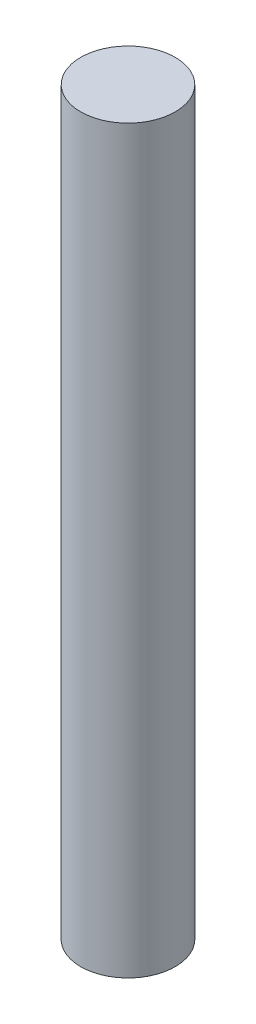
ISO-10303-21;
HEADER;
FILE_DESCRIPTION(('STEP AP214'),'2;1');
FILE_NAME('part.step','',(''),(''),'','','');
FILE_SCHEMA(('AUTOMOTIVE_DESIGN { 1 0 10303 214 1 1 1 1 }'));
ENDSEC;
DATA;
#1=APPLICATION_CONTEXT('core data for automotive mechanical design processes');
#2=APPLICATION_PROTOCOL_DEFINITION('international standard','automotive_design',2000,#1);
#3=PRODUCT_CONTEXT('',#1,'mechanical');
#4=PRODUCT('Part','Part','',(#3));
#5=PRODUCT_RELATED_PRODUCT_CATEGORY('part','',(#4));
#6=PRODUCT_DEFINITION_FORMATION('','',#4);
#7=PRODUCT_DEFINITION_CONTEXT('part definition',#1,'design');
#8=PRODUCT_DEFINITION('design','',#6,#7);
#9=PRODUCT_DEFINITION_SHAPE('','',#8);
#10=(LENGTH_UNIT() NAMED_UNIT(*) SI_UNIT(.MILLI.,.METRE.));
#11=(NAMED_UNIT(*) PLANE_ANGLE_UNIT() SI_UNIT($,.RADIAN.));
#12=(NAMED_UNIT(*) SI_UNIT($,.STERADIAN.) SOLID_ANGLE_UNIT());
#13=UNCERTAINTY_MEASURE_WITH_UNIT(LENGTH_MEASURE(1.E-05),#10,'distance_accuracy_value','');
#14=(GEOMETRIC_REPRESENTATION_CONTEXT(3) GLOBAL_UNCERTAINTY_ASSIGNED_CONTEXT((#13)) GLOBAL_UNIT_ASSIGNED_CONTEXT((#10,
#11,#12)) REPRESENTATION_CONTEXT('',''));
#15=CARTESIAN_POINT('',(0.,0.,0.));
#16=DIRECTION('',(0.,0.,1.));
#17=DIRECTION('',(1.,0.,0.));
#18=AXIS2_PLACEMENT_3D('',#15,#16,#17);
#19=CARTESIAN_POINT('',(0.,94.,0.));
#20=DIRECTION('',(0.,-1.,0.));
#21=DIRECTION('',(0.,0.,-1.));
#22=AXIS2_PLACEMENT_3D('',#19,#20,#21);
#23=CYLINDRICAL_SURFACE('',#22,6.);
#24=CARTESIAN_POINT('',(0.,94.,0.));
#25=DIRECTION('',(0.,1.,0.));
#26=DIRECTION('',(0.,0.,1.));
#27=AXIS2_PLACEMENT_3D('',#24,#25,#26);
#28=CIRCLE('',#27,6.);
#29=CARTESIAN_POINT('',(0.,94.,6.));
#30=VERTEX_POINT('',#29);
#31=EDGE_CURVE('E10',#30,#30,#28,.T.);
#32=ORIENTED_EDGE('',*,*,#31,.F.);
#33=EDGE_LOOP('',(#32));
#34=FACE_BOUND('',#33,.T.);
#35=CARTESIAN_POINT('',(0.,0.,0.));
#36=DIRECTION('',(0.,1.,0.));
#37=DIRECTION('',(0.,0.,1.));
#38=AXIS2_PLACEMENT_3D('',#35,#36,#37);
#39=CIRCLE('',#38,6.);
#40=CARTESIAN_POINT('',(0.,0.,6.));
#41=VERTEX_POINT('',#40);
#42=EDGE_CURVE('E34',#41,#41,#39,.T.);
#43=ORIENTED_EDGE('',*,*,#42,.T.);
#44=EDGE_LOOP('',(#43));
#45=FACE_BOUND('',#44,.T.);
#46=ADVANCED_FACE('F31',(#34,#45),#23,.T.);
#47=CARTESIAN_POINT('',(0.,94.,0.));
#48=DIRECTION('',(0.,1.,0.));
#49=DIRECTION('',(0.,0.,1.));
#50=AXIS2_PLACEMENT_3D('',#47,#48,#49);
#51=PLANE('',#50);
#52=ORIENTED_EDGE('',*,*,#31,.T.);
#53=EDGE_LOOP('',(#52));
#54=FACE_BOUND('',#53,.T.);
#55=ADVANCED_FACE('F46',(#54),#51,.T.);
#56=CARTESIAN_POINT('',(0.,0.,0.));
#57=DIRECTION('',(0.,1.,0.));
#58=DIRECTION('',(0.,0.,1.));
#59=AXIS2_PLACEMENT_3D('',#56,#57,#58);
#60=PLANE('',#59);
#61=ORIENTED_EDGE('',*,*,#42,.F.);
#62=EDGE_LOOP('',(#61));
#63=FACE_BOUND('',#62,.T.);
#64=ADVANCED_FACE('F44',(#63),#60,.F.);
#65=CLOSED_SHELL('',(#46,#55,#64));
#66=MANIFOLD_SOLID_BREP('B2',#65);
#67=ADVANCED_BREP_SHAPE_REPRESENTATION('',(#18,#66),#14);
#68=SHAPE_DEFINITION_REPRESENTATION(#9,#67);
ENDSEC;
END-ISO-10303-21;
